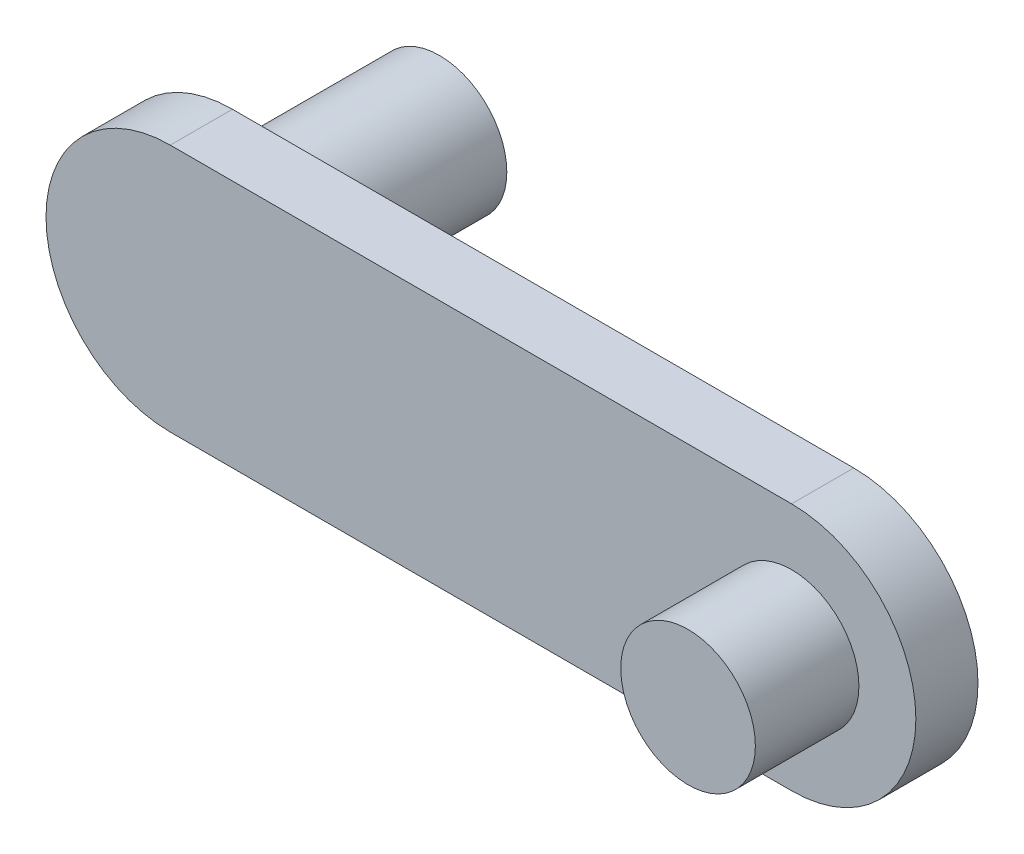
ISO-10303-21;
HEADER;
FILE_DESCRIPTION(('STEP AP214'),'2;1');
FILE_NAME('part.step','',(''),(''),'','','');
FILE_SCHEMA(('AUTOMOTIVE_DESIGN { 1 0 10303 214 1 1 1 1 }'));
ENDSEC;
DATA;
#1=APPLICATION_CONTEXT('core data for automotive mechanical design processes');
#2=APPLICATION_PROTOCOL_DEFINITION('international standard','automotive_design',2000,#1);
#3=PRODUCT_CONTEXT('',#1,'mechanical');
#4=PRODUCT('Part','Part','',(#3));
#5=PRODUCT_RELATED_PRODUCT_CATEGORY('part','',(#4));
#6=PRODUCT_DEFINITION_FORMATION('','',#4);
#7=PRODUCT_DEFINITION_CONTEXT('part definition',#1,'design');
#8=PRODUCT_DEFINITION('design','',#6,#7);
#9=PRODUCT_DEFINITION_SHAPE('','',#8);
#10=(LENGTH_UNIT() NAMED_UNIT(*) SI_UNIT(.MILLI.,.METRE.));
#11=(NAMED_UNIT(*) PLANE_ANGLE_UNIT() SI_UNIT($,.RADIAN.));
#12=(NAMED_UNIT(*) SI_UNIT($,.STERADIAN.) SOLID_ANGLE_UNIT());
#13=UNCERTAINTY_MEASURE_WITH_UNIT(LENGTH_MEASURE(1.E-05),#10,'distance_accuracy_value','');
#14=(GEOMETRIC_REPRESENTATION_CONTEXT(3) GLOBAL_UNCERTAINTY_ASSIGNED_CONTEXT((#13)) GLOBAL_UNIT_ASSIGNED_CONTEXT((#10,
#11,#12)) REPRESENTATION_CONTEXT('',''));
#15=CARTESIAN_POINT('',(0.,0.,0.));
#16=DIRECTION('',(0.,0.,1.));
#17=DIRECTION('',(1.,0.,0.));
#18=AXIS2_PLACEMENT_3D('',#15,#16,#17);
#19=CARTESIAN_POINT('',(-15.,0.,3.));
#20=DIRECTION('',(0.,0.,-1.));
#21=DIRECTION('',(-1.,0.,0.));
#22=AXIS2_PLACEMENT_3D('',#19,#20,#21);
#23=CYLINDRICAL_SURFACE('',#22,6.00000000000001);
#24=CARTESIAN_POINT('',(-15.,0.,0.));
#25=DIRECTION('',(0.,0.,1.));
#26=DIRECTION('',(1.,0.,0.));
#27=AXIS2_PLACEMENT_3D('',#24,#25,#26);
#28=CIRCLE('',#27,6.00000000000001);
#29=CARTESIAN_POINT('',(-15.,6.00000000000001,0.));
#30=VERTEX_POINT('',#29);
#31=CARTESIAN_POINT('',(-15.,-6.00000000000001,0.));
#32=VERTEX_POINT('',#31);
#33=EDGE_CURVE('E99',#30,#32,#28,.T.);
#34=ORIENTED_EDGE('',*,*,#33,.T.);
#35=DIRECTION('',(0.,0.,-1.));
#36=VECTOR('',#35,1.);
#37=CARTESIAN_POINT('',(-15.,-6.00000000000001,3.));
#38=LINE('',#37,#36);
#39=CARTESIAN_POINT('',(-15.,-6.00000000000001,3.));
#40=VERTEX_POINT('',#39);
#41=EDGE_CURVE('E41',#40,#32,#38,.T.);
#42=ORIENTED_EDGE('',*,*,#41,.F.);
#43=CARTESIAN_POINT('',(-15.,0.,3.));
#44=DIRECTION('',(0.,0.,1.));
#45=DIRECTION('',(1.,0.,0.));
#46=AXIS2_PLACEMENT_3D('',#43,#44,#45);
#47=CIRCLE('',#46,6.00000000000001);
#48=CARTESIAN_POINT('',(-15.,6.00000000000001,3.));
#49=VERTEX_POINT('',#48);
#50=EDGE_CURVE('E85',#49,#40,#47,.T.);
#51=ORIENTED_EDGE('',*,*,#50,.F.);
#52=DIRECTION('',(0.,0.,-1.));
#53=VECTOR('',#52,1.);
#54=CARTESIAN_POINT('',(-15.,6.00000000000001,3.));
#55=LINE('',#54,#53);
#56=EDGE_CURVE('E95',#49,#30,#55,.T.);
#57=ORIENTED_EDGE('',*,*,#56,.T.);
#58=EDGE_LOOP('',(#34,#42,#51,#57));
#59=FACE_BOUND('',#58,.T.);
#60=ADVANCED_FACE('F33',(#59),#23,.T.);
#61=CARTESIAN_POINT('',(-15.,-6.00000000000001,3.));
#62=DIRECTION('',(0.,1.,0.));
#63=DIRECTION('',(-1.,0.,0.));
#64=AXIS2_PLACEMENT_3D('',#61,#62,#63);
#65=PLANE('',#64);
#66=DIRECTION('',(1.,0.,0.));
#67=VECTOR('',#66,1.);
#68=CARTESIAN_POINT('',(-15.,-6.00000000000001,0.));
#69=LINE('',#68,#67);
#70=CARTESIAN_POINT('',(15.,-6.,0.));
#71=VERTEX_POINT('',#70);
#72=EDGE_CURVE('E90',#32,#71,#69,.T.);
#73=ORIENTED_EDGE('',*,*,#72,.T.);
#74=DIRECTION('',(0.,0.,-1.));
#75=VECTOR('',#74,1.);
#76=CARTESIAN_POINT('',(15.,-6.,3.));
#77=LINE('',#76,#75);
#78=CARTESIAN_POINT('',(15.,-6.,3.));
#79=VERTEX_POINT('',#78);
#80=EDGE_CURVE('E88',#79,#71,#77,.T.);
#81=ORIENTED_EDGE('',*,*,#80,.F.);
#82=DIRECTION('',(1.,0.,0.));
#83=VECTOR('',#82,1.);
#84=CARTESIAN_POINT('',(-15.,-6.00000000000001,3.));
#85=LINE('',#84,#83);
#86=EDGE_CURVE('E80',#40,#79,#85,.T.);
#87=ORIENTED_EDGE('',*,*,#86,.F.);
#88=ORIENTED_EDGE('',*,*,#41,.T.);
#89=EDGE_LOOP('',(#73,#81,#87,#88));
#90=FACE_BOUND('',#89,.T.);
#91=ADVANCED_FACE('F89',(#90),#65,.F.);
#92=CARTESIAN_POINT('',(15.,0.,3.));
#93=DIRECTION('',(0.,0.,-1.));
#94=DIRECTION('',(-1.,0.,0.));
#95=AXIS2_PLACEMENT_3D('',#92,#93,#94);
#96=CYLINDRICAL_SURFACE('',#95,6.00000000000001);
#97=CARTESIAN_POINT('',(15.,0.,0.));
#98=DIRECTION('',(0.,0.,1.));
#99=DIRECTION('',(1.,0.,0.));
#100=AXIS2_PLACEMENT_3D('',#97,#98,#99);
#101=CIRCLE('',#100,6.00000000000001);
#102=CARTESIAN_POINT('',(15.,6.00000000000001,0.));
#103=VERTEX_POINT('',#102);
#104=EDGE_CURVE('E66',#71,#103,#101,.T.);
#105=ORIENTED_EDGE('',*,*,#104,.T.);
#106=DIRECTION('',(0.,0.,-1.));
#107=VECTOR('',#106,1.);
#108=CARTESIAN_POINT('',(15.,6.00000000000001,3.));
#109=LINE('',#108,#107);
#110=CARTESIAN_POINT('',(15.,6.00000000000001,3.));
#111=VERTEX_POINT('',#110);
#112=EDGE_CURVE('E91',#111,#103,#109,.T.);
#113=ORIENTED_EDGE('',*,*,#112,.F.);
#114=CARTESIAN_POINT('',(15.,0.,3.));
#115=DIRECTION('',(0.,0.,1.));
#116=DIRECTION('',(1.,0.,0.));
#117=AXIS2_PLACEMENT_3D('',#114,#115,#116);
#118=CIRCLE('',#117,6.00000000000001);
#119=EDGE_CURVE('E83',#79,#111,#118,.T.);
#120=ORIENTED_EDGE('',*,*,#119,.F.);
#121=ORIENTED_EDGE('',*,*,#80,.T.);
#122=EDGE_LOOP('',(#105,#113,#120,#121));
#123=FACE_BOUND('',#122,.T.);
#124=ADVANCED_FACE('F93',(#123),#96,.T.);
#125=CARTESIAN_POINT('',(-15.,6.00000000000001,3.));
#126=DIRECTION('',(0.,-1.,0.));
#127=DIRECTION('',(1.,0.,0.));
#128=AXIS2_PLACEMENT_3D('',#125,#126,#127);
#129=PLANE('',#128);
#130=DIRECTION('',(-1.,0.,0.));
#131=VECTOR('',#130,1.);
#132=CARTESIAN_POINT('',(-15.,6.00000000000001,0.));
#133=LINE('',#132,#131);
#134=EDGE_CURVE('E72',#103,#30,#133,.T.);
#135=ORIENTED_EDGE('',*,*,#134,.T.);
#136=ORIENTED_EDGE('',*,*,#56,.F.);
#137=DIRECTION('',(-1.,0.,0.));
#138=VECTOR('',#137,1.);
#139=CARTESIAN_POINT('',(-15.,6.00000000000001,3.));
#140=LINE('',#139,#138);
#141=EDGE_CURVE('E49',#111,#49,#140,.T.);
#142=ORIENTED_EDGE('',*,*,#141,.F.);
#143=ORIENTED_EDGE('',*,*,#112,.T.);
#144=EDGE_LOOP('',(#135,#136,#142,#143));
#145=FACE_BOUND('',#144,.T.);
#146=ADVANCED_FACE('F122',(#145),#129,.F.);
#147=CARTESIAN_POINT('',(-15.,0.,3.));
#148=DIRECTION('',(0.,0.,1.));
#149=DIRECTION('',(1.,0.,0.));
#150=AXIS2_PLACEMENT_3D('',#147,#148,#149);
#151=PLANE('',#150);
#152=CARTESIAN_POINT('',(15.,0.,3.));
#153=DIRECTION('',(0.,0.,1.));
#154=DIRECTION('',(1.,0.,0.));
#155=AXIS2_PLACEMENT_3D('',#152,#153,#154);
#156=CIRCLE('',#155,3.25);
#157=CARTESIAN_POINT('',(18.25,0.,3.));
#158=VERTEX_POINT('',#157);
#159=EDGE_CURVE('E190',#158,#158,#156,.T.);
#160=ORIENTED_EDGE('',*,*,#159,.F.);
#161=EDGE_LOOP('',(#160));
#162=FACE_BOUND('',#161,.T.);
#163=ORIENTED_EDGE('',*,*,#50,.T.);
#164=ORIENTED_EDGE('',*,*,#86,.T.);
#165=ORIENTED_EDGE('',*,*,#119,.T.);
#166=ORIENTED_EDGE('',*,*,#141,.T.);
#167=EDGE_LOOP('',(#163,#164,#165,#166));
#168=FACE_BOUND('',#167,.T.);
#169=ADVANCED_FACE('F81',(#162,#168),#151,.T.);
#170=CARTESIAN_POINT('',(-15.,0.,0.));
#171=DIRECTION('',(0.,0.,1.));
#172=DIRECTION('',(1.,0.,0.));
#173=AXIS2_PLACEMENT_3D('',#170,#171,#172);
#174=PLANE('',#173);
#175=CARTESIAN_POINT('',(-15.,0.,0.));
#176=DIRECTION('',(0.,0.,1.));
#177=DIRECTION('',(1.,0.,0.));
#178=AXIS2_PLACEMENT_3D('',#175,#176,#177);
#179=CIRCLE('',#178,3.25);
#180=CARTESIAN_POINT('',(-11.75,0.,0.));
#181=VERTEX_POINT('',#180);
#182=EDGE_CURVE('E11',#181,#181,#179,.F.);
#183=ORIENTED_EDGE('',*,*,#182,.F.);
#184=EDGE_LOOP('',(#183));
#185=FACE_BOUND('',#184,.T.);
#186=ORIENTED_EDGE('',*,*,#33,.F.);
#187=ORIENTED_EDGE('',*,*,#134,.F.);
#188=ORIENTED_EDGE('',*,*,#104,.F.);
#189=ORIENTED_EDGE('',*,*,#72,.F.);
#190=EDGE_LOOP('',(#186,#187,#188,#189));
#191=FACE_BOUND('',#190,.T.);
#192=ADVANCED_FACE('F110',(#185,#191),#174,.F.);
#193=CARTESIAN_POINT('',(15.,0.,8.));
#194=DIRECTION('',(0.,0.,-1.));
#195=DIRECTION('',(-1.,0.,0.));
#196=AXIS2_PLACEMENT_3D('',#193,#194,#195);
#197=CYLINDRICAL_SURFACE('',#196,3.25);
#198=CARTESIAN_POINT('',(15.,0.,8.));
#199=DIRECTION('',(0.,0.,1.));
#200=DIRECTION('',(1.,0.,0.));
#201=AXIS2_PLACEMENT_3D('',#198,#199,#200);
#202=CIRCLE('',#201,3.25);
#203=CARTESIAN_POINT('',(18.25,0.,8.));
#204=VERTEX_POINT('',#203);
#205=EDGE_CURVE('E102',#204,#204,#202,.T.);
#206=ORIENTED_EDGE('',*,*,#205,.F.);
#207=EDGE_LOOP('',(#206));
#208=FACE_BOUND('',#207,.T.);
#209=ORIENTED_EDGE('',*,*,#159,.T.);
#210=EDGE_LOOP('',(#209));
#211=FACE_BOUND('',#210,.T.);
#212=ADVANCED_FACE('F112',(#208,#211),#197,.T.);
#213=CARTESIAN_POINT('',(15.,0.,8.));
#214=DIRECTION('',(0.,0.,1.));
#215=DIRECTION('',(1.,0.,0.));
#216=AXIS2_PLACEMENT_3D('',#213,#214,#215);
#217=PLANE('',#216);
#218=ORIENTED_EDGE('',*,*,#205,.T.);
#219=EDGE_LOOP('',(#218));
#220=FACE_BOUND('',#219,.T.);
#221=ADVANCED_FACE('F119',(#220),#217,.T.);
#222=CARTESIAN_POINT('',(-15.,0.,-10.));
#223=DIRECTION('',(0.,0.,1.));
#224=DIRECTION('',(1.,0.,0.));
#225=AXIS2_PLACEMENT_3D('',#222,#223,#224);
#226=CYLINDRICAL_SURFACE('',#225,3.25);
#227=CARTESIAN_POINT('',(-15.,0.,-10.));
#228=DIRECTION('',(0.,0.,-1.));
#229=DIRECTION('',(-1.,0.,0.));
#230=AXIS2_PLACEMENT_3D('',#227,#228,#229);
#231=CIRCLE('',#230,3.25);
#232=CARTESIAN_POINT('',(-18.25,0.,-10.));
#233=VERTEX_POINT('',#232);
#234=EDGE_CURVE('E189',#233,#233,#231,.T.);
#235=ORIENTED_EDGE('',*,*,#234,.F.);
#236=EDGE_LOOP('',(#235));
#237=FACE_BOUND('',#236,.T.);
#238=ORIENTED_EDGE('',*,*,#182,.T.);
#239=EDGE_LOOP('',(#238));
#240=FACE_BOUND('',#239,.T.);
#241=ADVANCED_FACE('F159',(#237,#240),#226,.T.);
#242=CARTESIAN_POINT('',(-15.,0.,-10.));
#243=DIRECTION('',(0.,0.,-1.));
#244=DIRECTION('',(-1.,0.,0.));
#245=AXIS2_PLACEMENT_3D('',#242,#243,#244);
#246=PLANE('',#245);
#247=ORIENTED_EDGE('',*,*,#234,.T.);
#248=EDGE_LOOP('',(#247));
#249=FACE_BOUND('',#248,.T.);
#250=ADVANCED_FACE('F173',(#249),#246,.T.);
#251=CLOSED_SHELL('',(#60,#91,#124,#146,#169,#192,#212,#221,#241,#250));
#252=MANIFOLD_SOLID_BREP('B2',#251);
#253=ADVANCED_BREP_SHAPE_REPRESENTATION('',(#18,#252),#14);
#254=SHAPE_DEFINITION_REPRESENTATION(#9,#253);
ENDSEC;
END-ISO-10303-21;
